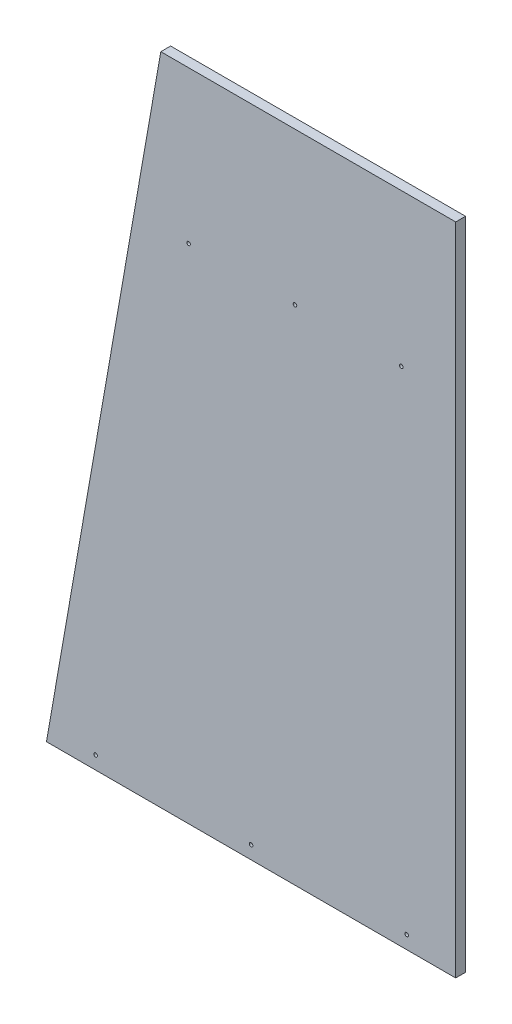
ISO-10303-21;
HEADER;
FILE_DESCRIPTION(('STEP AP214'),'2;1');
FILE_NAME('part.step','',(''),(''),'','','');
FILE_SCHEMA(('AUTOMOTIVE_DESIGN { 1 0 10303 214 1 1 1 1 }'));
ENDSEC;
DATA;
#1=APPLICATION_CONTEXT('core data for automotive mechanical design processes');
#2=APPLICATION_PROTOCOL_DEFINITION('international standard','automotive_design',2000,#1);
#3=PRODUCT_CONTEXT('',#1,'mechanical');
#4=PRODUCT('Part','Part','',(#3));
#5=PRODUCT_RELATED_PRODUCT_CATEGORY('part','',(#4));
#6=PRODUCT_DEFINITION_FORMATION('','',#4);
#7=PRODUCT_DEFINITION_CONTEXT('part definition',#1,'design');
#8=PRODUCT_DEFINITION('design','',#6,#7);
#9=PRODUCT_DEFINITION_SHAPE('','',#8);
#10=(LENGTH_UNIT() NAMED_UNIT(*) SI_UNIT(.MILLI.,.METRE.));
#11=(NAMED_UNIT(*) PLANE_ANGLE_UNIT() SI_UNIT($,.RADIAN.));
#12=(NAMED_UNIT(*) SI_UNIT($,.STERADIAN.) SOLID_ANGLE_UNIT());
#13=UNCERTAINTY_MEASURE_WITH_UNIT(LENGTH_MEASURE(1.E-05),#10,'distance_accuracy_value','');
#14=(GEOMETRIC_REPRESENTATION_CONTEXT(3) GLOBAL_UNCERTAINTY_ASSIGNED_CONTEXT((#13)) GLOBAL_UNIT_ASSIGNED_CONTEXT((#10,
#11,#12)) REPRESENTATION_CONTEXT('',''));
#15=CARTESIAN_POINT('',(0.,0.,0.));
#16=DIRECTION('',(0.,0.,1.));
#17=DIRECTION('',(1.,0.,0.));
#18=AXIS2_PLACEMENT_3D('',#15,#16,#17);
#19=CARTESIAN_POINT('',(0.,0.,6.));
#20=DIRECTION('',(0.,0.,1.));
#21=DIRECTION('',(1.,0.,0.));
#22=AXIS2_PLACEMENT_3D('',#19,#20,#21);
#23=PLANE('',#22);
#24=CARTESIAN_POINT('',(125.,7.99999999999997,6.));
#25=DIRECTION('',(0.,0.,1.));
#26=DIRECTION('',(1.,0.,0.));
#27=AXIS2_PLACEMENT_3D('',#24,#25,#26);
#28=CIRCLE('',#27,1.09999999999999);
#29=CARTESIAN_POINT('',(126.1,7.99999999999997,6.));
#30=VERTEX_POINT('',#29);
#31=EDGE_CURVE('E135',#30,#30,#28,.T.);
#32=ORIENTED_EDGE('',*,*,#31,.F.);
#33=EDGE_LOOP('',(#32));
#34=FACE_BOUND('',#33,.T.);
#35=CARTESIAN_POINT('',(30.,7.99999999999997,6.));
#36=DIRECTION('',(0.,0.,1.));
#37=DIRECTION('',(1.,0.,0.));
#38=AXIS2_PLACEMENT_3D('',#35,#36,#37);
#39=CIRCLE('',#38,1.1);
#40=CARTESIAN_POINT('',(31.1,7.99999999999997,6.));
#41=VERTEX_POINT('',#40);
#42=EDGE_CURVE('E123',#41,#41,#39,.T.);
#43=ORIENTED_EDGE('',*,*,#42,.F.);
#44=EDGE_LOOP('',(#43));
#45=FACE_BOUND('',#44,.T.);
#46=CARTESIAN_POINT('',(86.8031746031734,307.,6.));
#47=DIRECTION('',(0.,0.,1.));
#48=DIRECTION('',(1.,0.,0.));
#49=AXIS2_PLACEMENT_3D('',#46,#47,#48);
#50=CIRCLE('',#49,1.09999999999998);
#51=CARTESIAN_POINT('',(87.9031746031734,307.,6.));
#52=VERTEX_POINT('',#51);
#53=EDGE_CURVE('E102',#52,#52,#50,.T.);
#54=ORIENTED_EDGE('',*,*,#53,.F.);
#55=EDGE_LOOP('',(#54));
#56=FACE_BOUND('',#55,.T.);
#57=DIRECTION('',(1.,0.,0.));
#58=VECTOR('',#57,1.);
#59=CARTESIAN_POINT('',(250.,0.,6.));
#60=LINE('',#59,#58);
#61=CARTESIAN_POINT('',(0.,0.,6.));
#62=VERTEX_POINT('',#61);
#63=CARTESIAN_POINT('',(250.,0.,6.));
#64=VERTEX_POINT('',#63);
#65=EDGE_CURVE('E87',#62,#64,#60,.T.);
#66=ORIENTED_EDGE('',*,*,#65,.T.);
#67=DIRECTION('',(0.,1.,0.));
#68=VECTOR('',#67,1.);
#69=CARTESIAN_POINT('',(249.999999999998,400.,6.));
#70=LINE('',#69,#68);
#71=CARTESIAN_POINT('',(249.999999999998,400.,6.));
#72=VERTEX_POINT('',#71);
#73=EDGE_CURVE('E82',#64,#72,#70,.T.);
#74=ORIENTED_EDGE('',*,*,#73,.T.);
#75=DIRECTION('',(-1.,0.,0.));
#76=VECTOR('',#75,1.);
#77=CARTESIAN_POINT('',(69.8412698412683,400.,6.));
#78=LINE('',#77,#76);
#79=CARTESIAN_POINT('',(69.8412698412683,400.,6.));
#80=VERTEX_POINT('',#79);
#81=EDGE_CURVE('E85',#72,#80,#78,.T.);
#82=ORIENTED_EDGE('',*,*,#81,.T.);
#83=DIRECTION('',(-0.172001023480206,-0.985096770841201,0.));
#84=VECTOR('',#83,1.);
#85=CARTESIAN_POINT('',(0.,0.,6.));
#86=LINE('',#85,#84);
#87=EDGE_CURVE('E52',#80,#62,#86,.T.);
#88=ORIENTED_EDGE('',*,*,#87,.T.);
#89=EDGE_LOOP('',(#66,#74,#82,#88));
#90=FACE_BOUND('',#89,.T.);
#91=CARTESIAN_POINT('',(151.803174603173,307.,6.));
#92=DIRECTION('',(0.,0.,1.));
#93=DIRECTION('',(1.,0.,0.));
#94=AXIS2_PLACEMENT_3D('',#91,#92,#93);
#95=CIRCLE('',#94,1.09999999999999);
#96=CARTESIAN_POINT('',(152.903174603173,307.,6.));
#97=VERTEX_POINT('',#96);
#98=EDGE_CURVE('E117',#97,#97,#95,.T.);
#99=ORIENTED_EDGE('',*,*,#98,.F.);
#100=EDGE_LOOP('',(#99));
#101=FACE_BOUND('',#100,.T.);
#102=CARTESIAN_POINT('',(220.,7.99999999999997,6.));
#103=DIRECTION('',(0.,0.,1.));
#104=DIRECTION('',(1.,0.,0.));
#105=AXIS2_PLACEMENT_3D('',#102,#103,#104);
#106=CIRCLE('',#105,1.09999999999999);
#107=CARTESIAN_POINT('',(221.1,7.99999999999997,6.));
#108=VERTEX_POINT('',#107);
#109=EDGE_CURVE('E129',#108,#108,#106,.T.);
#110=ORIENTED_EDGE('',*,*,#109,.F.);
#111=EDGE_LOOP('',(#110));
#112=FACE_BOUND('',#111,.T.);
#113=CARTESIAN_POINT('',(216.803174603173,307.,6.));
#114=DIRECTION('',(0.,0.,1.));
#115=DIRECTION('',(1.,0.,0.));
#116=AXIS2_PLACEMENT_3D('',#113,#114,#115);
#117=CIRCLE('',#116,1.09999999999999);
#118=CARTESIAN_POINT('',(217.903174603173,307.,6.));
#119=VERTEX_POINT('',#118);
#120=EDGE_CURVE('E141',#119,#119,#117,.T.);
#121=ORIENTED_EDGE('',*,*,#120,.F.);
#122=EDGE_LOOP('',(#121));
#123=FACE_BOUND('',#122,.T.);
#124=ADVANCED_FACE('F35',(#34,#45,#56,#90,#101,#112,#123),#23,.T.);
#125=CARTESIAN_POINT('',(0.,0.,0.));
#126=DIRECTION('',(0.,0.,1.));
#127=DIRECTION('',(1.,0.,0.));
#128=AXIS2_PLACEMENT_3D('',#125,#126,#127);
#129=PLANE('',#128);
#130=CARTESIAN_POINT('',(125.,7.99999999999997,0.));
#131=DIRECTION('',(0.,0.,1.));
#132=DIRECTION('',(1.,0.,0.));
#133=AXIS2_PLACEMENT_3D('',#130,#131,#132);
#134=CIRCLE('',#133,1.09999999999999);
#135=CARTESIAN_POINT('',(126.1,7.99999999999997,0.));
#136=VERTEX_POINT('',#135);
#137=EDGE_CURVE('E138',#136,#136,#134,.T.);
#138=ORIENTED_EDGE('',*,*,#137,.T.);
#139=EDGE_LOOP('',(#138));
#140=FACE_BOUND('',#139,.T.);
#141=CARTESIAN_POINT('',(30.,7.99999999999997,0.));
#142=DIRECTION('',(0.,0.,1.));
#143=DIRECTION('',(1.,0.,0.));
#144=AXIS2_PLACEMENT_3D('',#141,#142,#143);
#145=CIRCLE('',#144,1.1);
#146=CARTESIAN_POINT('',(31.1,7.99999999999997,0.));
#147=VERTEX_POINT('',#146);
#148=EDGE_CURVE('E126',#147,#147,#145,.T.);
#149=ORIENTED_EDGE('',*,*,#148,.T.);
#150=EDGE_LOOP('',(#149));
#151=FACE_BOUND('',#150,.T.);
#152=CARTESIAN_POINT('',(86.8031746031734,307.,0.));
#153=DIRECTION('',(0.,0.,1.));
#154=DIRECTION('',(1.,0.,0.));
#155=AXIS2_PLACEMENT_3D('',#152,#153,#154);
#156=CIRCLE('',#155,1.09999999999998);
#157=CARTESIAN_POINT('',(87.9031746031734,307.,0.));
#158=VERTEX_POINT('',#157);
#159=EDGE_CURVE('E114',#158,#158,#156,.T.);
#160=ORIENTED_EDGE('',*,*,#159,.T.);
#161=EDGE_LOOP('',(#160));
#162=FACE_BOUND('',#161,.T.);
#163=DIRECTION('',(1.,0.,0.));
#164=VECTOR('',#163,1.);
#165=CARTESIAN_POINT('',(250.,0.,0.));
#166=LINE('',#165,#164);
#167=CARTESIAN_POINT('',(0.,0.,0.));
#168=VERTEX_POINT('',#167);
#169=CARTESIAN_POINT('',(250.,0.,0.));
#170=VERTEX_POINT('',#169);
#171=EDGE_CURVE('E99',#168,#170,#166,.T.);
#172=ORIENTED_EDGE('',*,*,#171,.F.);
#173=DIRECTION('',(-0.172001023480206,-0.985096770841201,0.));
#174=VECTOR('',#173,1.);
#175=CARTESIAN_POINT('',(0.,0.,0.));
#176=LINE('',#175,#174);
#177=CARTESIAN_POINT('',(69.8412698412683,400.,0.));
#178=VERTEX_POINT('',#177);
#179=EDGE_CURVE('E75',#178,#168,#176,.T.);
#180=ORIENTED_EDGE('',*,*,#179,.F.);
#181=DIRECTION('',(-1.,0.,0.));
#182=VECTOR('',#181,1.);
#183=CARTESIAN_POINT('',(69.8412698412683,400.,0.));
#184=LINE('',#183,#182);
#185=CARTESIAN_POINT('',(249.999999999998,400.,0.));
#186=VERTEX_POINT('',#185);
#187=EDGE_CURVE('E69',#186,#178,#184,.T.);
#188=ORIENTED_EDGE('',*,*,#187,.F.);
#189=DIRECTION('',(0.,1.,0.));
#190=VECTOR('',#189,1.);
#191=CARTESIAN_POINT('',(249.999999999998,400.,0.));
#192=LINE('',#191,#190);
#193=EDGE_CURVE('E91',#170,#186,#192,.T.);
#194=ORIENTED_EDGE('',*,*,#193,.F.);
#195=EDGE_LOOP('',(#172,#180,#188,#194));
#196=FACE_BOUND('',#195,.T.);
#197=CARTESIAN_POINT('',(151.803174603173,307.,0.));
#198=DIRECTION('',(0.,0.,1.));
#199=DIRECTION('',(1.,0.,0.));
#200=AXIS2_PLACEMENT_3D('',#197,#198,#199);
#201=CIRCLE('',#200,1.09999999999999);
#202=CARTESIAN_POINT('',(152.903174603173,307.,0.));
#203=VERTEX_POINT('',#202);
#204=EDGE_CURVE('E120',#203,#203,#201,.T.);
#205=ORIENTED_EDGE('',*,*,#204,.T.);
#206=EDGE_LOOP('',(#205));
#207=FACE_BOUND('',#206,.T.);
#208=CARTESIAN_POINT('',(220.,7.99999999999997,0.));
#209=DIRECTION('',(0.,0.,1.));
#210=DIRECTION('',(1.,0.,0.));
#211=AXIS2_PLACEMENT_3D('',#208,#209,#210);
#212=CIRCLE('',#211,1.09999999999999);
#213=CARTESIAN_POINT('',(221.1,7.99999999999997,0.));
#214=VERTEX_POINT('',#213);
#215=EDGE_CURVE('E132',#214,#214,#212,.T.);
#216=ORIENTED_EDGE('',*,*,#215,.T.);
#217=EDGE_LOOP('',(#216));
#218=FACE_BOUND('',#217,.T.);
#219=CARTESIAN_POINT('',(216.803174603173,307.,0.));
#220=DIRECTION('',(0.,0.,1.));
#221=DIRECTION('',(1.,0.,0.));
#222=AXIS2_PLACEMENT_3D('',#219,#220,#221);
#223=CIRCLE('',#222,1.09999999999999);
#224=CARTESIAN_POINT('',(217.903174603173,307.,0.));
#225=VERTEX_POINT('',#224);
#226=EDGE_CURVE('E144',#225,#225,#223,.T.);
#227=ORIENTED_EDGE('',*,*,#226,.T.);
#228=EDGE_LOOP('',(#227));
#229=FACE_BOUND('',#228,.T.);
#230=ADVANCED_FACE('F110',(#140,#151,#162,#196,#207,#218,#229),#129,.F.);
#231=CARTESIAN_POINT('',(250.,0.,6.));
#232=DIRECTION('',(0.,1.,0.));
#233=DIRECTION('',(0.,0.,1.));
#234=AXIS2_PLACEMENT_3D('',#231,#232,#233);
#235=PLANE('',#234);
#236=ORIENTED_EDGE('',*,*,#171,.T.);
#237=DIRECTION('',(0.,0.,-1.));
#238=VECTOR('',#237,1.);
#239=CARTESIAN_POINT('',(250.,0.,6.));
#240=LINE('',#239,#238);
#241=EDGE_CURVE('E11',#64,#170,#240,.T.);
#242=ORIENTED_EDGE('',*,*,#241,.F.);
#243=ORIENTED_EDGE('',*,*,#65,.F.);
#244=DIRECTION('',(0.,0.,-1.));
#245=VECTOR('',#244,1.);
#246=CARTESIAN_POINT('',(0.,0.,6.));
#247=LINE('',#246,#245);
#248=EDGE_CURVE('E95',#62,#168,#247,.T.);
#249=ORIENTED_EDGE('',*,*,#248,.T.);
#250=EDGE_LOOP('',(#236,#242,#243,#249));
#251=FACE_BOUND('',#250,.T.);
#252=ADVANCED_FACE('F37',(#251),#235,.F.);
#253=CARTESIAN_POINT('',(249.999999999998,400.,6.));
#254=DIRECTION('',(-1.,0.,0.));
#255=DIRECTION('',(0.,-1.,0.));
#256=AXIS2_PLACEMENT_3D('',#253,#254,#255);
#257=PLANE('',#256);
#258=ORIENTED_EDGE('',*,*,#193,.T.);
#259=DIRECTION('',(0.,0.,-1.));
#260=VECTOR('',#259,1.);
#261=CARTESIAN_POINT('',(249.999999999998,400.,6.));
#262=LINE('',#261,#260);
#263=EDGE_CURVE('E44',#72,#186,#262,.T.);
#264=ORIENTED_EDGE('',*,*,#263,.F.);
#265=ORIENTED_EDGE('',*,*,#73,.F.);
#266=ORIENTED_EDGE('',*,*,#241,.T.);
#267=EDGE_LOOP('',(#258,#264,#265,#266));
#268=FACE_BOUND('',#267,.T.);
#269=ADVANCED_FACE('F90',(#268),#257,.F.);
#270=CARTESIAN_POINT('',(69.8412698412683,400.,6.));
#271=DIRECTION('',(0.,-1.,0.));
#272=DIRECTION('',(0.,0.,-1.));
#273=AXIS2_PLACEMENT_3D('',#270,#271,#272);
#274=PLANE('',#273);
#275=ORIENTED_EDGE('',*,*,#187,.T.);
#276=DIRECTION('',(0.,0.,-1.));
#277=VECTOR('',#276,1.);
#278=CARTESIAN_POINT('',(69.8412698412683,400.,6.));
#279=LINE('',#278,#277);
#280=EDGE_CURVE('E92',#80,#178,#279,.T.);
#281=ORIENTED_EDGE('',*,*,#280,.F.);
#282=ORIENTED_EDGE('',*,*,#81,.F.);
#283=ORIENTED_EDGE('',*,*,#263,.T.);
#284=EDGE_LOOP('',(#275,#281,#282,#283));
#285=FACE_BOUND('',#284,.T.);
#286=ADVANCED_FACE('F93',(#285),#274,.F.);
#287=CARTESIAN_POINT('',(0.,0.,6.));
#288=DIRECTION('',(0.985096770841201,-0.172001023480206,0.));
#289=DIRECTION('',(0.172001023480206,0.985096770841201,0.));
#290=AXIS2_PLACEMENT_3D('',#287,#288,#289);
#291=PLANE('',#290);
#292=ORIENTED_EDGE('',*,*,#179,.T.);
#293=ORIENTED_EDGE('',*,*,#248,.F.);
#294=ORIENTED_EDGE('',*,*,#87,.F.);
#295=ORIENTED_EDGE('',*,*,#280,.T.);
#296=EDGE_LOOP('',(#292,#293,#294,#295));
#297=FACE_BOUND('',#296,.T.);
#298=ADVANCED_FACE('F107',(#297),#291,.F.);
#299=CARTESIAN_POINT('',(86.8031746031734,307.,6.));
#300=DIRECTION('',(0.,0.,-1.));
#301=DIRECTION('',(-1.,0.,0.));
#302=AXIS2_PLACEMENT_3D('',#299,#300,#301);
#303=CYLINDRICAL_SURFACE('',#302,1.09999999999998);
#304=ORIENTED_EDGE('',*,*,#53,.T.);
#305=EDGE_LOOP('',(#304));
#306=FACE_BOUND('',#305,.T.);
#307=ORIENTED_EDGE('',*,*,#159,.F.);
#308=EDGE_LOOP('',(#307));
#309=FACE_BOUND('',#308,.T.);
#310=ADVANCED_FACE('F164',(#306,#309),#303,.F.);
#311=CARTESIAN_POINT('',(151.803174603173,307.,6.));
#312=DIRECTION('',(0.,0.,-1.));
#313=DIRECTION('',(-1.,0.,0.));
#314=AXIS2_PLACEMENT_3D('',#311,#312,#313);
#315=CYLINDRICAL_SURFACE('',#314,1.09999999999999);
#316=ORIENTED_EDGE('',*,*,#98,.T.);
#317=EDGE_LOOP('',(#316));
#318=FACE_BOUND('',#317,.T.);
#319=ORIENTED_EDGE('',*,*,#204,.F.);
#320=EDGE_LOOP('',(#319));
#321=FACE_BOUND('',#320,.T.);
#322=ADVANCED_FACE('F210',(#318,#321),#315,.F.);
#323=CARTESIAN_POINT('',(30.,7.99999999999997,6.));
#324=DIRECTION('',(0.,0.,-1.));
#325=DIRECTION('',(-1.,0.,0.));
#326=AXIS2_PLACEMENT_3D('',#323,#324,#325);
#327=CYLINDRICAL_SURFACE('',#326,1.1);
#328=ORIENTED_EDGE('',*,*,#42,.T.);
#329=EDGE_LOOP('',(#328));
#330=FACE_BOUND('',#329,.T.);
#331=ORIENTED_EDGE('',*,*,#148,.F.);
#332=EDGE_LOOP('',(#331));
#333=FACE_BOUND('',#332,.T.);
#334=ADVANCED_FACE('F218',(#330,#333),#327,.F.);
#335=CARTESIAN_POINT('',(220.,7.99999999999997,6.));
#336=DIRECTION('',(0.,0.,-1.));
#337=DIRECTION('',(-1.,0.,0.));
#338=AXIS2_PLACEMENT_3D('',#335,#336,#337);
#339=CYLINDRICAL_SURFACE('',#338,1.09999999999999);
#340=ORIENTED_EDGE('',*,*,#109,.T.);
#341=EDGE_LOOP('',(#340));
#342=FACE_BOUND('',#341,.T.);
#343=ORIENTED_EDGE('',*,*,#215,.F.);
#344=EDGE_LOOP('',(#343));
#345=FACE_BOUND('',#344,.T.);
#346=ADVANCED_FACE('F226',(#342,#345),#339,.F.);
#347=CARTESIAN_POINT('',(125.,7.99999999999997,6.));
#348=DIRECTION('',(0.,0.,-1.));
#349=DIRECTION('',(-1.,0.,0.));
#350=AXIS2_PLACEMENT_3D('',#347,#348,#349);
#351=CYLINDRICAL_SURFACE('',#350,1.09999999999999);
#352=ORIENTED_EDGE('',*,*,#31,.T.);
#353=EDGE_LOOP('',(#352));
#354=FACE_BOUND('',#353,.T.);
#355=ORIENTED_EDGE('',*,*,#137,.F.);
#356=EDGE_LOOP('',(#355));
#357=FACE_BOUND('',#356,.T.);
#358=ADVANCED_FACE('F235',(#354,#357),#351,.F.);
#359=CARTESIAN_POINT('',(216.803174603173,307.,6.));
#360=DIRECTION('',(0.,0.,-1.));
#361=DIRECTION('',(-1.,0.,0.));
#362=AXIS2_PLACEMENT_3D('',#359,#360,#361);
#363=CYLINDRICAL_SURFACE('',#362,1.09999999999999);
#364=ORIENTED_EDGE('',*,*,#120,.T.);
#365=EDGE_LOOP('',(#364));
#366=FACE_BOUND('',#365,.T.);
#367=ORIENTED_EDGE('',*,*,#226,.F.);
#368=EDGE_LOOP('',(#367));
#369=FACE_BOUND('',#368,.T.);
#370=ADVANCED_FACE('F150',(#366,#369),#363,.F.);
#371=CLOSED_SHELL('',(#124,#230,#252,#269,#286,#298,#310,#322,#334,#346,#358,#370));
#372=MANIFOLD_SOLID_BREP('B2',#371);
#373=ADVANCED_BREP_SHAPE_REPRESENTATION('',(#18,#372),#14);
#374=SHAPE_DEFINITION_REPRESENTATION(#9,#373);
ENDSEC;
END-ISO-10303-21;
